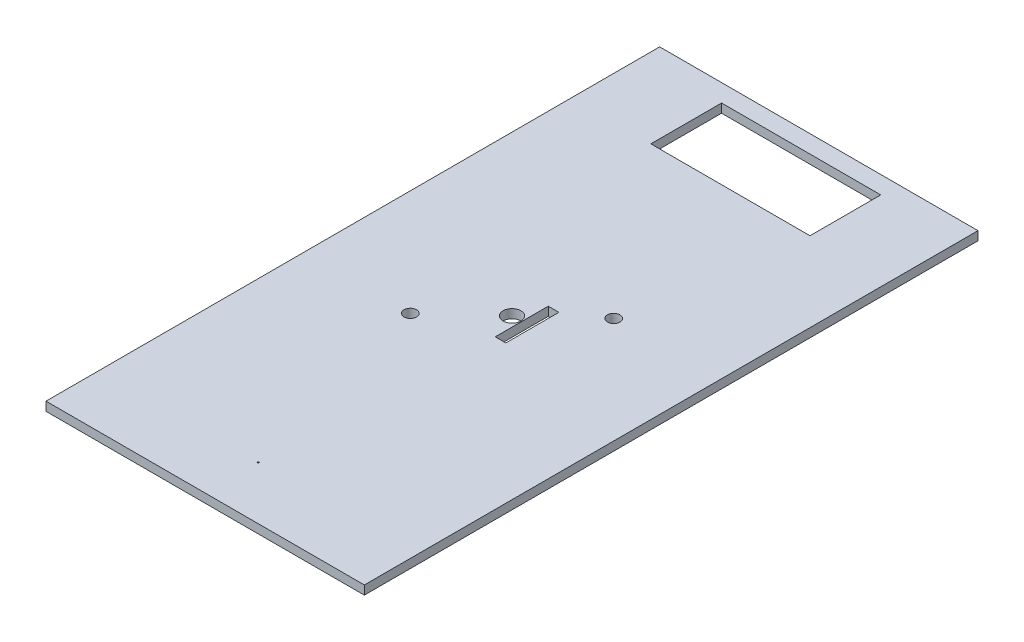
ISO-10303-21;
HEADER;
FILE_DESCRIPTION(('STEP AP214'),'2;1');
FILE_NAME('part.step','',(''),(''),'','','');
FILE_SCHEMA(('AUTOMOTIVE_DESIGN { 1 0 10303 214 1 1 1 1 }'));
ENDSEC;
DATA;
#1=APPLICATION_CONTEXT('core data for automotive mechanical design processes');
#2=APPLICATION_PROTOCOL_DEFINITION('international standard','automotive_design',2000,#1);
#3=PRODUCT_CONTEXT('',#1,'mechanical');
#4=PRODUCT('Part','Part','',(#3));
#5=PRODUCT_RELATED_PRODUCT_CATEGORY('part','',(#4));
#6=PRODUCT_DEFINITION_FORMATION('','',#4);
#7=PRODUCT_DEFINITION_CONTEXT('part definition',#1,'design');
#8=PRODUCT_DEFINITION('design','',#6,#7);
#9=PRODUCT_DEFINITION_SHAPE('','',#8);
#10=(LENGTH_UNIT() NAMED_UNIT(*) SI_UNIT(.MILLI.,.METRE.));
#11=(NAMED_UNIT(*) PLANE_ANGLE_UNIT() SI_UNIT($,.RADIAN.));
#12=(NAMED_UNIT(*) SI_UNIT($,.STERADIAN.) SOLID_ANGLE_UNIT());
#13=UNCERTAINTY_MEASURE_WITH_UNIT(LENGTH_MEASURE(1.E-05),#10,'distance_accuracy_value','');
#14=(GEOMETRIC_REPRESENTATION_CONTEXT(3) GLOBAL_UNCERTAINTY_ASSIGNED_CONTEXT((#13)) GLOBAL_UNIT_ASSIGNED_CONTEXT((#10,
#11,#12)) REPRESENTATION_CONTEXT('',''));
#15=CARTESIAN_POINT('',(0.,0.,0.));
#16=DIRECTION('',(0.,0.,1.));
#17=DIRECTION('',(1.,0.,0.));
#18=AXIS2_PLACEMENT_3D('',#15,#16,#17);
#19=CARTESIAN_POINT('',(0.,5.,0.));
#20=DIRECTION('',(0.,1.,0.));
#21=DIRECTION('',(0.,0.,1.));
#22=AXIS2_PLACEMENT_3D('',#19,#20,#21);
#23=PLANE('',#22);
#24=DIRECTION('',(0.,0.,-1.));
#25=VECTOR('',#24,1.);
#26=CARTESIAN_POINT('',(11.5,5.,-15.));
#27=LINE('',#26,#25);
#28=CARTESIAN_POINT('',(11.5,5.,15.));
#29=VERTEX_POINT('',#28);
#30=CARTESIAN_POINT('',(11.5,5.,-15.));
#31=VERTEX_POINT('',#30);
#32=EDGE_CURVE('E61',#29,#31,#27,.T.);
#33=ORIENTED_EDGE('',*,*,#32,.F.);
#34=DIRECTION('',(1.,0.,0.));
#35=VECTOR('',#34,1.);
#36=CARTESIAN_POINT('',(5.5,5.,15.));
#37=LINE('',#36,#35);
#38=CARTESIAN_POINT('',(5.5,5.,15.));
#39=VERTEX_POINT('',#38);
#40=EDGE_CURVE('E155',#39,#29,#37,.T.);
#41=ORIENTED_EDGE('',*,*,#40,.F.);
#42=DIRECTION('',(0.,0.,1.));
#43=VECTOR('',#42,1.);
#44=CARTESIAN_POINT('',(5.5,5.,-15.));
#45=LINE('',#44,#43);
#46=CARTESIAN_POINT('',(5.5,5.,-15.));
#47=VERTEX_POINT('',#46);
#48=EDGE_CURVE('E138',#47,#39,#45,.T.);
#49=ORIENTED_EDGE('',*,*,#48,.F.);
#50=DIRECTION('',(-1.,0.,0.));
#51=VECTOR('',#50,1.);
#52=CARTESIAN_POINT('',(5.5,5.,-15.));
#53=LINE('',#52,#51);
#54=EDGE_CURVE('E148',#31,#47,#53,.T.);
#55=ORIENTED_EDGE('',*,*,#54,.F.);
#56=EDGE_LOOP('',(#33,#41,#49,#55));
#57=FACE_BOUND('',#56,.T.);
#58=CARTESIAN_POINT('',(30.,5.,-27.5));
#59=DIRECTION('',(0.,1.,0.));
#60=DIRECTION('',(0.,0.,1.));
#61=AXIS2_PLACEMENT_3D('',#58,#59,#60);
#62=CIRCLE('',#61,3.55);
#63=CARTESIAN_POINT('',(30.,5.,-23.95));
#64=VERTEX_POINT('',#63);
#65=EDGE_CURVE('E170',#64,#64,#62,.T.);
#66=ORIENTED_EDGE('',*,*,#65,.F.);
#67=EDGE_LOOP('',(#66));
#68=FACE_BOUND('',#67,.T.);
#69=CARTESIAN_POINT('',(-30.,5.,27.5));
#70=DIRECTION('',(0.,1.,0.));
#71=DIRECTION('',(0.,0.,1.));
#72=AXIS2_PLACEMENT_3D('',#69,#70,#71);
#73=CIRCLE('',#72,3.55);
#74=CARTESIAN_POINT('',(-30.,5.,31.05));
#75=VERTEX_POINT('',#74);
#76=EDGE_CURVE('E165',#75,#75,#73,.T.);
#77=ORIENTED_EDGE('',*,*,#76,.F.);
#78=EDGE_LOOP('',(#77));
#79=FACE_BOUND('',#78,.T.);
#80=CARTESIAN_POINT('',(0.,5.,0.));
#81=DIRECTION('',(0.,1.,0.));
#82=DIRECTION('',(0.,0.,1.));
#83=AXIS2_PLACEMENT_3D('',#80,#81,#82);
#84=CIRCLE('',#83,5.05);
#85=CARTESIAN_POINT('',(0.,5.,5.05));
#86=VERTEX_POINT('',#85);
#87=EDGE_CURVE('E231',#86,#86,#84,.T.);
#88=ORIENTED_EDGE('',*,*,#87,.F.);
#89=EDGE_LOOP('',(#88));
#90=FACE_BOUND('',#89,.T.);
#91=DIRECTION('',(0.,0.,1.));
#92=VECTOR('',#91,1.);
#93=CARTESIAN_POINT('',(-90.,5.,173.5));
#94=LINE('',#93,#92);
#95=CARTESIAN_POINT('',(-90.,5.,-173.5));
#96=VERTEX_POINT('',#95);
#97=CARTESIAN_POINT('',(-90.,5.,173.5));
#98=VERTEX_POINT('',#97);
#99=EDGE_CURVE('E239',#96,#98,#94,.T.);
#100=ORIENTED_EDGE('',*,*,#99,.T.);
#101=DIRECTION('',(1.,0.,0.));
#102=VECTOR('',#101,1.);
#103=CARTESIAN_POINT('',(90.,5.,173.5));
#104=LINE('',#103,#102);
#105=CARTESIAN_POINT('',(90.,5.,173.5));
#106=VERTEX_POINT('',#105);
#107=EDGE_CURVE('E243',#98,#106,#104,.T.);
#108=ORIENTED_EDGE('',*,*,#107,.T.);
#109=DIRECTION('',(0.,0.,-1.));
#110=VECTOR('',#109,1.);
#111=CARTESIAN_POINT('',(90.,5.,173.5));
#112=LINE('',#111,#110);
#113=CARTESIAN_POINT('',(90.,5.,-173.5));
#114=VERTEX_POINT('',#113);
#115=EDGE_CURVE('E247',#106,#114,#112,.T.);
#116=ORIENTED_EDGE('',*,*,#115,.T.);
#117=DIRECTION('',(-1.,0.,0.));
#118=VECTOR('',#117,1.);
#119=CARTESIAN_POINT('',(90.,5.,-173.5));
#120=LINE('',#119,#118);
#121=EDGE_CURVE('E250',#114,#96,#120,.T.);
#122=ORIENTED_EDGE('',*,*,#121,.T.);
#123=EDGE_LOOP('',(#100,#108,#116,#122));
#124=FACE_BOUND('',#123,.T.);
#125=CARTESIAN_POINT('',(0.,5.,143.5));
#126=DIRECTION('',(0.,1.,0.));
#127=DIRECTION('',(0.,0.,1.));
#128=AXIS2_PLACEMENT_3D('',#125,#126,#127);
#129=CIRCLE('',#128,0.450000000000005);
#130=CARTESIAN_POINT('',(0.,5.,143.95));
#131=VERTEX_POINT('',#130);
#132=EDGE_CURVE('E223',#131,#131,#129,.T.);
#133=ORIENTED_EDGE('',*,*,#132,.F.);
#134=EDGE_LOOP('',(#133));
#135=FACE_BOUND('',#134,.T.);
#136=DIRECTION('',(-1.,0.,0.));
#137=VECTOR('',#136,1.);
#138=CARTESIAN_POINT('',(-45.,5.,-163.5));
#139=LINE('',#138,#137);
#140=CARTESIAN_POINT('',(45.,5.,-163.5));
#141=VERTEX_POINT('',#140);
#142=CARTESIAN_POINT('',(-45.,5.,-163.5));
#143=VERTEX_POINT('',#142);
#144=EDGE_CURVE('E181',#141,#143,#139,.T.);
#145=ORIENTED_EDGE('',*,*,#144,.F.);
#146=DIRECTION('',(0.,0.,-1.));
#147=VECTOR('',#146,1.);
#148=CARTESIAN_POINT('',(45.,5.,-163.5));
#149=LINE('',#148,#147);
#150=CARTESIAN_POINT('',(45.,5.,-123.5));
#151=VERTEX_POINT('',#150);
#152=EDGE_CURVE('E178',#151,#141,#149,.T.);
#153=ORIENTED_EDGE('',*,*,#152,.F.);
#154=DIRECTION('',(1.,0.,0.));
#155=VECTOR('',#154,1.);
#156=CARTESIAN_POINT('',(-45.,5.,-123.5));
#157=LINE('',#156,#155);
#158=CARTESIAN_POINT('',(-45.,5.,-123.5));
#159=VERTEX_POINT('',#158);
#160=EDGE_CURVE('E189',#159,#151,#157,.T.);
#161=ORIENTED_EDGE('',*,*,#160,.F.);
#162=DIRECTION('',(0.,0.,1.));
#163=VECTOR('',#162,1.);
#164=CARTESIAN_POINT('',(-45.,5.,-163.5));
#165=LINE('',#164,#163);
#166=EDGE_CURVE('E185',#143,#159,#165,.T.);
#167=ORIENTED_EDGE('',*,*,#166,.F.);
#168=EDGE_LOOP('',(#145,#153,#161,#167));
#169=FACE_BOUND('',#168,.T.);
#170=ADVANCED_FACE('F45',(#57,#68,#79,#90,#124,#135,#169),#23,.T.);
#171=CARTESIAN_POINT('',(0.,0.,0.));
#172=DIRECTION('',(0.,1.,0.));
#173=DIRECTION('',(0.,0.,1.));
#174=AXIS2_PLACEMENT_3D('',#171,#172,#173);
#175=PLANE('',#174);
#176=DIRECTION('',(1.,0.,0.));
#177=VECTOR('',#176,1.);
#178=CARTESIAN_POINT('',(0.,0.,15.));
#179=LINE('',#178,#177);
#180=CARTESIAN_POINT('',(5.5,0.,15.));
#181=VERTEX_POINT('',#180);
#182=CARTESIAN_POINT('',(11.5,0.,15.));
#183=VERTEX_POINT('',#182);
#184=EDGE_CURVE('E54',#181,#183,#179,.T.);
#185=ORIENTED_EDGE('',*,*,#184,.T.);
#186=DIRECTION('',(0.,0.,-1.));
#187=VECTOR('',#186,1.);
#188=CARTESIAN_POINT('',(11.5,0.,0.));
#189=LINE('',#188,#187);
#190=CARTESIAN_POINT('',(11.5,0.,-15.));
#191=VERTEX_POINT('',#190);
#192=EDGE_CURVE('E11',#183,#191,#189,.T.);
#193=ORIENTED_EDGE('',*,*,#192,.T.);
#194=DIRECTION('',(-1.,0.,0.));
#195=VECTOR('',#194,1.);
#196=CARTESIAN_POINT('',(0.,0.,-15.));
#197=LINE('',#196,#195);
#198=CARTESIAN_POINT('',(5.5,0.,-15.));
#199=VERTEX_POINT('',#198);
#200=EDGE_CURVE('E280',#191,#199,#197,.T.);
#201=ORIENTED_EDGE('',*,*,#200,.T.);
#202=DIRECTION('',(0.,0.,1.));
#203=VECTOR('',#202,1.);
#204=CARTESIAN_POINT('',(5.5,0.,0.));
#205=LINE('',#204,#203);
#206=EDGE_CURVE('E141',#199,#181,#205,.T.);
#207=ORIENTED_EDGE('',*,*,#206,.T.);
#208=EDGE_LOOP('',(#185,#193,#201,#207));
#209=FACE_BOUND('',#208,.T.);
#210=CARTESIAN_POINT('',(30.,0.,-27.5));
#211=DIRECTION('',(0.,1.,0.));
#212=DIRECTION('',(0.,0.,1.));
#213=AXIS2_PLACEMENT_3D('',#210,#211,#212);
#214=CIRCLE('',#213,3.55);
#215=CARTESIAN_POINT('',(30.,0.,-23.95));
#216=VERTEX_POINT('',#215);
#217=EDGE_CURVE('E198',#216,#216,#214,.T.);
#218=ORIENTED_EDGE('',*,*,#217,.T.);
#219=EDGE_LOOP('',(#218));
#220=FACE_BOUND('',#219,.T.);
#221=CARTESIAN_POINT('',(-30.,0.,27.5));
#222=DIRECTION('',(0.,1.,0.));
#223=DIRECTION('',(0.,0.,1.));
#224=AXIS2_PLACEMENT_3D('',#221,#222,#223);
#225=CIRCLE('',#224,3.55);
#226=CARTESIAN_POINT('',(-30.,0.,31.05));
#227=VERTEX_POINT('',#226);
#228=EDGE_CURVE('E174',#227,#227,#225,.T.);
#229=ORIENTED_EDGE('',*,*,#228,.T.);
#230=EDGE_LOOP('',(#229));
#231=FACE_BOUND('',#230,.T.);
#232=CARTESIAN_POINT('',(0.,0.,143.5));
#233=DIRECTION('',(0.,1.,0.));
#234=DIRECTION('',(0.,0.,1.));
#235=AXIS2_PLACEMENT_3D('',#232,#233,#234);
#236=CIRCLE('',#235,0.450000000000005);
#237=CARTESIAN_POINT('',(0.,0.,143.95));
#238=VERTEX_POINT('',#237);
#239=EDGE_CURVE('E222',#238,#238,#236,.T.);
#240=ORIENTED_EDGE('',*,*,#239,.T.);
#241=EDGE_LOOP('',(#240));
#242=FACE_BOUND('',#241,.T.);
#243=CARTESIAN_POINT('',(0.,0.,0.));
#244=DIRECTION('',(0.,1.,0.));
#245=DIRECTION('',(0.,0.,1.));
#246=AXIS2_PLACEMENT_3D('',#243,#244,#245);
#247=CIRCLE('',#246,5.05);
#248=CARTESIAN_POINT('',(0.,0.,5.05));
#249=VERTEX_POINT('',#248);
#250=EDGE_CURVE('E227',#249,#249,#247,.T.);
#251=ORIENTED_EDGE('',*,*,#250,.T.);
#252=EDGE_LOOP('',(#251));
#253=FACE_BOUND('',#252,.T.);
#254=DIRECTION('',(0.,0.,1.));
#255=VECTOR('',#254,1.);
#256=CARTESIAN_POINT('',(-90.,0.,173.5));
#257=LINE('',#256,#255);
#258=CARTESIAN_POINT('',(-90.,0.,-173.5));
#259=VERTEX_POINT('',#258);
#260=CARTESIAN_POINT('',(-90.,0.,173.5));
#261=VERTEX_POINT('',#260);
#262=EDGE_CURVE('E235',#259,#261,#257,.T.);
#263=ORIENTED_EDGE('',*,*,#262,.F.);
#264=DIRECTION('',(-1.,0.,0.));
#265=VECTOR('',#264,1.);
#266=CARTESIAN_POINT('',(90.,0.,-173.5));
#267=LINE('',#266,#265);
#268=CARTESIAN_POINT('',(90.,0.,-173.5));
#269=VERTEX_POINT('',#268);
#270=EDGE_CURVE('E244',#269,#259,#267,.T.);
#271=ORIENTED_EDGE('',*,*,#270,.F.);
#272=DIRECTION('',(0.,0.,-1.));
#273=VECTOR('',#272,1.);
#274=CARTESIAN_POINT('',(90.,0.,173.5));
#275=LINE('',#274,#273);
#276=CARTESIAN_POINT('',(90.,0.,173.5));
#277=VERTEX_POINT('',#276);
#278=EDGE_CURVE('E260',#277,#269,#275,.T.);
#279=ORIENTED_EDGE('',*,*,#278,.F.);
#280=DIRECTION('',(1.,0.,0.));
#281=VECTOR('',#280,1.);
#282=CARTESIAN_POINT('',(90.,0.,173.5));
#283=LINE('',#282,#281);
#284=EDGE_CURVE('E257',#261,#277,#283,.T.);
#285=ORIENTED_EDGE('',*,*,#284,.F.);
#286=EDGE_LOOP('',(#263,#271,#279,#285));
#287=FACE_BOUND('',#286,.T.);
#288=DIRECTION('',(0.,0.,-1.));
#289=VECTOR('',#288,1.);
#290=CARTESIAN_POINT('',(45.,0.,-163.5));
#291=LINE('',#290,#289);
#292=CARTESIAN_POINT('',(45.,0.,-123.5));
#293=VERTEX_POINT('',#292);
#294=CARTESIAN_POINT('',(45.,0.,-163.5));
#295=VERTEX_POINT('',#294);
#296=EDGE_CURVE('E193',#293,#295,#291,.T.);
#297=ORIENTED_EDGE('',*,*,#296,.T.);
#298=DIRECTION('',(-1.,0.,0.));
#299=VECTOR('',#298,1.);
#300=CARTESIAN_POINT('',(-45.,0.,-163.5));
#301=LINE('',#300,#299);
#302=CARTESIAN_POINT('',(-45.,0.,-163.5));
#303=VERTEX_POINT('',#302);
#304=EDGE_CURVE('E197',#295,#303,#301,.T.);
#305=ORIENTED_EDGE('',*,*,#304,.T.);
#306=DIRECTION('',(0.,0.,1.));
#307=VECTOR('',#306,1.);
#308=CARTESIAN_POINT('',(-45.,0.,-163.5));
#309=LINE('',#308,#307);
#310=CARTESIAN_POINT('',(-45.,0.,-123.5));
#311=VERTEX_POINT('',#310);
#312=EDGE_CURVE('E202',#303,#311,#309,.T.);
#313=ORIENTED_EDGE('',*,*,#312,.T.);
#314=DIRECTION('',(1.,0.,0.));
#315=VECTOR('',#314,1.);
#316=CARTESIAN_POINT('',(-45.,0.,-123.5));
#317=LINE('',#316,#315);
#318=EDGE_CURVE('E182',#311,#293,#317,.T.);
#319=ORIENTED_EDGE('',*,*,#318,.T.);
#320=EDGE_LOOP('',(#297,#305,#313,#319));
#321=FACE_BOUND('',#320,.T.);
#322=ADVANCED_FACE('F293',(#209,#220,#231,#242,#253,#287,#321),#175,.F.);
#323=CARTESIAN_POINT('',(-90.,5.,173.5));
#324=DIRECTION('',(1.,0.,0.));
#325=DIRECTION('',(0.,0.,-1.));
#326=AXIS2_PLACEMENT_3D('',#323,#324,#325);
#327=PLANE('',#326);
#328=ORIENTED_EDGE('',*,*,#262,.T.);
#329=DIRECTION('',(0.,-1.,0.));
#330=VECTOR('',#329,1.);
#331=CARTESIAN_POINT('',(-90.,5.,173.5));
#332=LINE('',#331,#330);
#333=EDGE_CURVE('E276',#98,#261,#332,.T.);
#334=ORIENTED_EDGE('',*,*,#333,.F.);
#335=ORIENTED_EDGE('',*,*,#99,.F.);
#336=DIRECTION('',(0.,-1.,0.));
#337=VECTOR('',#336,1.);
#338=CARTESIAN_POINT('',(-90.,5.,-173.5));
#339=LINE('',#338,#337);
#340=EDGE_CURVE('E253',#96,#259,#339,.T.);
#341=ORIENTED_EDGE('',*,*,#340,.T.);
#342=EDGE_LOOP('',(#328,#334,#335,#341));
#343=FACE_BOUND('',#342,.T.);
#344=ADVANCED_FACE('F47',(#343),#327,.F.);
#345=CARTESIAN_POINT('',(90.,5.,173.5));
#346=DIRECTION('',(0.,0.,-1.));
#347=DIRECTION('',(-1.,0.,0.));
#348=AXIS2_PLACEMENT_3D('',#345,#346,#347);
#349=PLANE('',#348);
#350=ORIENTED_EDGE('',*,*,#284,.T.);
#351=DIRECTION('',(0.,-1.,0.));
#352=VECTOR('',#351,1.);
#353=CARTESIAN_POINT('',(90.,5.,173.5));
#354=LINE('',#353,#352);
#355=EDGE_CURVE('E272',#106,#277,#354,.T.);
#356=ORIENTED_EDGE('',*,*,#355,.F.);
#357=ORIENTED_EDGE('',*,*,#107,.F.);
#358=ORIENTED_EDGE('',*,*,#333,.T.);
#359=EDGE_LOOP('',(#350,#356,#357,#358));
#360=FACE_BOUND('',#359,.T.);
#361=ADVANCED_FACE('F327',(#360),#349,.F.);
#362=CARTESIAN_POINT('',(90.,5.,173.5));
#363=DIRECTION('',(-1.,0.,0.));
#364=DIRECTION('',(0.,0.,1.));
#365=AXIS2_PLACEMENT_3D('',#362,#363,#364);
#366=PLANE('',#365);
#367=ORIENTED_EDGE('',*,*,#278,.T.);
#368=DIRECTION('',(0.,-1.,0.));
#369=VECTOR('',#368,1.);
#370=CARTESIAN_POINT('',(90.,5.,-173.5));
#371=LINE('',#370,#369);
#372=EDGE_CURVE('E268',#114,#269,#371,.T.);
#373=ORIENTED_EDGE('',*,*,#372,.F.);
#374=ORIENTED_EDGE('',*,*,#115,.F.);
#375=ORIENTED_EDGE('',*,*,#355,.T.);
#376=EDGE_LOOP('',(#367,#373,#374,#375));
#377=FACE_BOUND('',#376,.T.);
#378=ADVANCED_FACE('F324',(#377),#366,.F.);
#379=CARTESIAN_POINT('',(90.,5.,-173.5));
#380=DIRECTION('',(0.,0.,1.));
#381=DIRECTION('',(1.,0.,0.));
#382=AXIS2_PLACEMENT_3D('',#379,#380,#381);
#383=PLANE('',#382);
#384=ORIENTED_EDGE('',*,*,#270,.T.);
#385=ORIENTED_EDGE('',*,*,#340,.F.);
#386=ORIENTED_EDGE('',*,*,#121,.F.);
#387=ORIENTED_EDGE('',*,*,#372,.T.);
#388=EDGE_LOOP('',(#384,#385,#386,#387));
#389=FACE_BOUND('',#388,.T.);
#390=ADVANCED_FACE('F321',(#389),#383,.F.);
#391=CARTESIAN_POINT('',(0.,5.,0.));
#392=DIRECTION('',(0.,-1.,0.));
#393=DIRECTION('',(0.,0.,-1.));
#394=AXIS2_PLACEMENT_3D('',#391,#392,#393);
#395=CYLINDRICAL_SURFACE('',#394,5.05);
#396=ORIENTED_EDGE('',*,*,#87,.T.);
#397=EDGE_LOOP('',(#396));
#398=FACE_BOUND('',#397,.T.);
#399=ORIENTED_EDGE('',*,*,#250,.F.);
#400=EDGE_LOOP('',(#399));
#401=FACE_BOUND('',#400,.T.);
#402=ADVANCED_FACE('F318',(#398,#401),#395,.F.);
#403=CARTESIAN_POINT('',(0.,5.,143.5));
#404=DIRECTION('',(0.,-1.,0.));
#405=DIRECTION('',(0.,0.,-1.));
#406=AXIS2_PLACEMENT_3D('',#403,#404,#405);
#407=CYLINDRICAL_SURFACE('',#406,0.450000000000005);
#408=ORIENTED_EDGE('',*,*,#132,.T.);
#409=EDGE_LOOP('',(#408));
#410=FACE_BOUND('',#409,.T.);
#411=ORIENTED_EDGE('',*,*,#239,.F.);
#412=EDGE_LOOP('',(#411));
#413=FACE_BOUND('',#412,.T.);
#414=ADVANCED_FACE('F382',(#410,#413),#407,.F.);
#415=CARTESIAN_POINT('',(45.,5.,-163.5));
#416=DIRECTION('',(-1.,0.,0.));
#417=DIRECTION('',(0.,0.,1.));
#418=AXIS2_PLACEMENT_3D('',#415,#416,#417);
#419=PLANE('',#418);
#420=ORIENTED_EDGE('',*,*,#296,.F.);
#421=DIRECTION('',(0.,-1.,0.));
#422=VECTOR('',#421,1.);
#423=CARTESIAN_POINT('',(45.,5.,-123.5));
#424=LINE('',#423,#422);
#425=EDGE_CURVE('E192',#151,#293,#424,.T.);
#426=ORIENTED_EDGE('',*,*,#425,.F.);
#427=ORIENTED_EDGE('',*,*,#152,.T.);
#428=DIRECTION('',(0.,-1.,0.));
#429=VECTOR('',#428,1.);
#430=CARTESIAN_POINT('',(45.,5.,-163.5));
#431=LINE('',#430,#429);
#432=EDGE_CURVE('E218',#141,#295,#431,.T.);
#433=ORIENTED_EDGE('',*,*,#432,.T.);
#434=EDGE_LOOP('',(#420,#426,#427,#433));
#435=FACE_BOUND('',#434,.T.);
#436=ADVANCED_FACE('F364',(#435),#419,.T.);
#437=CARTESIAN_POINT('',(-45.,5.,-163.5));
#438=DIRECTION('',(0.,0.,1.));
#439=DIRECTION('',(1.,0.,0.));
#440=AXIS2_PLACEMENT_3D('',#437,#438,#439);
#441=PLANE('',#440);
#442=ORIENTED_EDGE('',*,*,#304,.F.);
#443=ORIENTED_EDGE('',*,*,#432,.F.);
#444=ORIENTED_EDGE('',*,*,#144,.T.);
#445=DIRECTION('',(0.,-1.,0.));
#446=VECTOR('',#445,1.);
#447=CARTESIAN_POINT('',(-45.,5.,-163.5));
#448=LINE('',#447,#446);
#449=EDGE_CURVE('E215',#143,#303,#448,.T.);
#450=ORIENTED_EDGE('',*,*,#449,.T.);
#451=EDGE_LOOP('',(#442,#443,#444,#450));
#452=FACE_BOUND('',#451,.T.);
#453=ADVANCED_FACE('F358',(#452),#441,.T.);
#454=CARTESIAN_POINT('',(-45.,5.,-163.5));
#455=DIRECTION('',(1.,0.,0.));
#456=DIRECTION('',(0.,0.,-1.));
#457=AXIS2_PLACEMENT_3D('',#454,#455,#456);
#458=PLANE('',#457);
#459=ORIENTED_EDGE('',*,*,#312,.F.);
#460=ORIENTED_EDGE('',*,*,#449,.F.);
#461=ORIENTED_EDGE('',*,*,#166,.T.);
#462=DIRECTION('',(0.,-1.,0.));
#463=VECTOR('',#462,1.);
#464=CARTESIAN_POINT('',(-45.,5.,-123.5));
#465=LINE('',#464,#463);
#466=EDGE_CURVE('E212',#159,#311,#465,.T.);
#467=ORIENTED_EDGE('',*,*,#466,.T.);
#468=EDGE_LOOP('',(#459,#460,#461,#467));
#469=FACE_BOUND('',#468,.T.);
#470=ADVANCED_FACE('F361',(#469),#458,.T.);
#471=CARTESIAN_POINT('',(-45.,5.,-123.5));
#472=DIRECTION('',(0.,0.,-1.));
#473=DIRECTION('',(-1.,0.,0.));
#474=AXIS2_PLACEMENT_3D('',#471,#472,#473);
#475=PLANE('',#474);
#476=ORIENTED_EDGE('',*,*,#318,.F.);
#477=ORIENTED_EDGE('',*,*,#466,.F.);
#478=ORIENTED_EDGE('',*,*,#160,.T.);
#479=ORIENTED_EDGE('',*,*,#425,.T.);
#480=EDGE_LOOP('',(#476,#477,#478,#479));
#481=FACE_BOUND('',#480,.T.);
#482=ADVANCED_FACE('F367',(#481),#475,.T.);
#483=CARTESIAN_POINT('',(-30.,-95.,27.5));
#484=DIRECTION('',(0.,1.,0.));
#485=DIRECTION('',(0.,0.,1.));
#486=AXIS2_PLACEMENT_3D('',#483,#484,#485);
#487=CYLINDRICAL_SURFACE('',#486,3.55);
#488=ORIENTED_EDGE('',*,*,#76,.T.);
#489=EDGE_LOOP('',(#488));
#490=FACE_BOUND('',#489,.T.);
#491=ORIENTED_EDGE('',*,*,#228,.F.);
#492=EDGE_LOOP('',(#491));
#493=FACE_BOUND('',#492,.T.);
#494=ADVANCED_FACE('F308',(#490,#493),#487,.F.);
#495=CARTESIAN_POINT('',(30.,-95.,-27.5));
#496=DIRECTION('',(0.,1.,0.));
#497=DIRECTION('',(0.,0.,1.));
#498=AXIS2_PLACEMENT_3D('',#495,#496,#497);
#499=CYLINDRICAL_SURFACE('',#498,3.55);
#500=ORIENTED_EDGE('',*,*,#65,.T.);
#501=EDGE_LOOP('',(#500));
#502=FACE_BOUND('',#501,.T.);
#503=ORIENTED_EDGE('',*,*,#217,.F.);
#504=EDGE_LOOP('',(#503));
#505=FACE_BOUND('',#504,.T.);
#506=ADVANCED_FACE('F300',(#502,#505),#499,.F.);
#507=CARTESIAN_POINT('',(11.5,-5.,-15.));
#508=DIRECTION('',(1.,0.,0.));
#509=DIRECTION('',(0.,0.,-1.));
#510=AXIS2_PLACEMENT_3D('',#507,#508,#509);
#511=PLANE('',#510);
#512=DIRECTION('',(0.,1.,0.));
#513=VECTOR('',#512,1.);
#514=CARTESIAN_POINT('',(11.5,-5.,15.));
#515=LINE('',#514,#513);
#516=EDGE_CURVE('E162',#183,#29,#515,.T.);
#517=ORIENTED_EDGE('',*,*,#516,.T.);
#518=ORIENTED_EDGE('',*,*,#32,.T.);
#519=DIRECTION('',(0.,1.,0.));
#520=VECTOR('',#519,1.);
#521=CARTESIAN_POINT('',(11.5,-5.,-15.));
#522=LINE('',#521,#520);
#523=EDGE_CURVE('E145',#191,#31,#522,.T.);
#524=ORIENTED_EDGE('',*,*,#523,.F.);
#525=ORIENTED_EDGE('',*,*,#192,.F.);
#526=EDGE_LOOP('',(#517,#518,#524,#525));
#527=FACE_BOUND('',#526,.T.);
#528=ADVANCED_FACE('F298',(#527),#511,.F.);
#529=CARTESIAN_POINT('',(5.5,-5.,15.));
#530=DIRECTION('',(0.,0.,1.));
#531=DIRECTION('',(1.,0.,0.));
#532=AXIS2_PLACEMENT_3D('',#529,#530,#531);
#533=PLANE('',#532);
#534=DIRECTION('',(0.,1.,0.));
#535=VECTOR('',#534,1.);
#536=CARTESIAN_POINT('',(5.5,-5.,15.));
#537=LINE('',#536,#535);
#538=EDGE_CURVE('E144',#181,#39,#537,.T.);
#539=ORIENTED_EDGE('',*,*,#538,.T.);
#540=ORIENTED_EDGE('',*,*,#40,.T.);
#541=ORIENTED_EDGE('',*,*,#516,.F.);
#542=ORIENTED_EDGE('',*,*,#184,.F.);
#543=EDGE_LOOP('',(#539,#540,#541,#542));
#544=FACE_BOUND('',#543,.T.);
#545=ADVANCED_FACE('F297',(#544),#533,.F.);
#546=CARTESIAN_POINT('',(5.5,-5.,-15.));
#547=DIRECTION('',(-1.,0.,0.));
#548=DIRECTION('',(0.,0.,1.));
#549=AXIS2_PLACEMENT_3D('',#546,#547,#548);
#550=PLANE('',#549);
#551=DIRECTION('',(0.,1.,0.));
#552=VECTOR('',#551,1.);
#553=CARTESIAN_POINT('',(5.5,-5.,-15.));
#554=LINE('',#553,#552);
#555=EDGE_CURVE('E69',#199,#47,#554,.T.);
#556=ORIENTED_EDGE('',*,*,#555,.T.);
#557=ORIENTED_EDGE('',*,*,#48,.T.);
#558=ORIENTED_EDGE('',*,*,#538,.F.);
#559=ORIENTED_EDGE('',*,*,#206,.F.);
#560=EDGE_LOOP('',(#556,#557,#558,#559));
#561=FACE_BOUND('',#560,.T.);
#562=ADVANCED_FACE('F135',(#561),#550,.F.);
#563=CARTESIAN_POINT('',(5.5,-5.,-15.));
#564=DIRECTION('',(0.,0.,-1.));
#565=DIRECTION('',(-1.,0.,0.));
#566=AXIS2_PLACEMENT_3D('',#563,#564,#565);
#567=PLANE('',#566);
#568=ORIENTED_EDGE('',*,*,#523,.T.);
#569=ORIENTED_EDGE('',*,*,#54,.T.);
#570=ORIENTED_EDGE('',*,*,#555,.F.);
#571=ORIENTED_EDGE('',*,*,#200,.F.);
#572=EDGE_LOOP('',(#568,#569,#570,#571));
#573=FACE_BOUND('',#572,.T.);
#574=ADVANCED_FACE('F149',(#573),#567,.F.);
#575=CLOSED_SHELL('',(#170,#322,#344,#361,#378,#390,#402,#414,#436,#453,#470,#482,#494,#506,
#528,#545,#562,#574));
#576=MANIFOLD_SOLID_BREP('B2',#575);
#577=ADVANCED_BREP_SHAPE_REPRESENTATION('',(#18,#576),#14);
#578=SHAPE_DEFINITION_REPRESENTATION(#9,#577);
ENDSEC;
END-ISO-10303-21;
